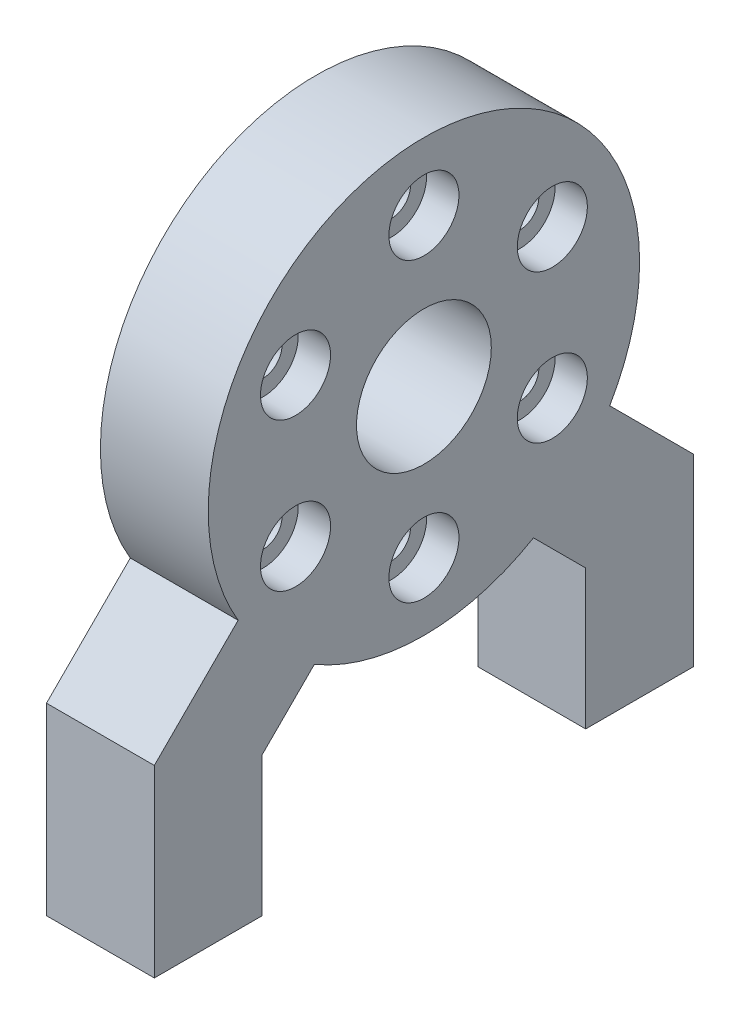
ISO-10303-21;
HEADER;
FILE_DESCRIPTION(('STEP AP214'),'2;1');
FILE_NAME('part.step','',(''),(''),'','','');
FILE_SCHEMA(('AUTOMOTIVE_DESIGN { 1 0 10303 214 1 1 1 1 }'));
ENDSEC;
DATA;
#1=APPLICATION_CONTEXT('core data for automotive mechanical design processes');
#2=APPLICATION_PROTOCOL_DEFINITION('international standard','automotive_design',2000,#1);
#3=PRODUCT_CONTEXT('',#1,'mechanical');
#4=PRODUCT('Part','Part','',(#3));
#5=PRODUCT_RELATED_PRODUCT_CATEGORY('part','',(#4));
#6=PRODUCT_DEFINITION_FORMATION('','',#4);
#7=PRODUCT_DEFINITION_CONTEXT('part definition',#1,'design');
#8=PRODUCT_DEFINITION('design','',#6,#7);
#9=PRODUCT_DEFINITION_SHAPE('','',#8);
#10=(LENGTH_UNIT() NAMED_UNIT(*) SI_UNIT(.MILLI.,.METRE.));
#11=(NAMED_UNIT(*) PLANE_ANGLE_UNIT() SI_UNIT($,.RADIAN.));
#12=(NAMED_UNIT(*) SI_UNIT($,.STERADIAN.) SOLID_ANGLE_UNIT());
#13=UNCERTAINTY_MEASURE_WITH_UNIT(LENGTH_MEASURE(1.E-05),#10,'distance_accuracy_value','');
#14=(GEOMETRIC_REPRESENTATION_CONTEXT(3) GLOBAL_UNCERTAINTY_ASSIGNED_CONTEXT((#13)) GLOBAL_UNIT_ASSIGNED_CONTEXT((#10,
#11,#12)) REPRESENTATION_CONTEXT('',''));
#15=CARTESIAN_POINT('',(0.,0.,0.));
#16=DIRECTION('',(0.,0.,1.));
#17=DIRECTION('',(1.,0.,0.));
#18=AXIS2_PLACEMENT_3D('',#15,#16,#17);
#19=CARTESIAN_POINT('',(5.,13.75,0.));
#20=DIRECTION('',(-1.,0.,0.));
#21=DIRECTION('',(0.,0.,1.));
#22=AXIS2_PLACEMENT_3D('',#19,#20,#21);
#23=CYLINDRICAL_SURFACE('',#22,1.75);
#24=CARTESIAN_POINT('',(-5.,13.75,0.));
#25=DIRECTION('',(1.,0.,0.));
#26=DIRECTION('',(0.,0.,-1.));
#27=AXIS2_PLACEMENT_3D('',#24,#25,#26);
#28=CIRCLE('',#27,1.75);
#29=CARTESIAN_POINT('',(-5.,13.75,-1.75));
#30=VERTEX_POINT('',#29);
#31=EDGE_CURVE('E239',#30,#30,#28,.T.);
#32=ORIENTED_EDGE('',*,*,#31,.F.);
#33=EDGE_LOOP('',(#32));
#34=FACE_BOUND('',#33,.T.);
#35=CARTESIAN_POINT('',(2.,13.75,0.));
#36=DIRECTION('',(1.,0.,0.));
#37=DIRECTION('',(0.,0.,-1.));
#38=AXIS2_PLACEMENT_3D('',#35,#36,#37);
#39=CIRCLE('',#38,1.75);
#40=CARTESIAN_POINT('',(2.,13.75,-1.75));
#41=VERTEX_POINT('',#40);
#42=EDGE_CURVE('E45',#41,#41,#39,.T.);
#43=ORIENTED_EDGE('',*,*,#42,.T.);
#44=EDGE_LOOP('',(#43));
#45=FACE_BOUND('',#44,.T.);
#46=ADVANCED_FACE('F41',(#34,#45),#23,.F.);
#47=CARTESIAN_POINT('',(5.,6.875,-11.907849302036));
#48=DIRECTION('',(-1.,0.,0.));
#49=DIRECTION('',(0.,0.,1.));
#50=AXIS2_PLACEMENT_3D('',#47,#48,#49);
#51=CYLINDRICAL_SURFACE('',#50,1.75);
#52=CARTESIAN_POINT('',(-5.,6.875,-11.907849302036));
#53=DIRECTION('',(1.,0.,0.));
#54=DIRECTION('',(0.,0.,-1.));
#55=AXIS2_PLACEMENT_3D('',#52,#53,#54);
#56=CIRCLE('',#55,1.75);
#57=CARTESIAN_POINT('',(-5.,6.875,-13.657849302036));
#58=VERTEX_POINT('',#57);
#59=EDGE_CURVE('E236',#58,#58,#56,.T.);
#60=ORIENTED_EDGE('',*,*,#59,.F.);
#61=EDGE_LOOP('',(#60));
#62=FACE_BOUND('',#61,.T.);
#63=CARTESIAN_POINT('',(2.,6.875,-11.907849302036));
#64=DIRECTION('',(1.,0.,0.));
#65=DIRECTION('',(0.,0.,-1.));
#66=AXIS2_PLACEMENT_3D('',#63,#64,#65);
#67=CIRCLE('',#66,1.75);
#68=CARTESIAN_POINT('',(2.,6.875,-13.657849302036));
#69=VERTEX_POINT('',#68);
#70=EDGE_CURVE('E261',#69,#69,#67,.T.);
#71=ORIENTED_EDGE('',*,*,#70,.T.);
#72=EDGE_LOOP('',(#71));
#73=FACE_BOUND('',#72,.T.);
#74=ADVANCED_FACE('F356',(#62,#73),#51,.F.);
#75=CARTESIAN_POINT('',(5.,-6.875,-11.907849302036));
#76=DIRECTION('',(-1.,0.,0.));
#77=DIRECTION('',(0.,0.,1.));
#78=AXIS2_PLACEMENT_3D('',#75,#76,#77);
#79=CYLINDRICAL_SURFACE('',#78,1.75);
#80=CARTESIAN_POINT('',(-5.,-6.875,-11.907849302036));
#81=DIRECTION('',(1.,0.,0.));
#82=DIRECTION('',(0.,0.,-1.));
#83=AXIS2_PLACEMENT_3D('',#80,#81,#82);
#84=CIRCLE('',#83,1.75);
#85=CARTESIAN_POINT('',(-5.,-6.875,-13.657849302036));
#86=VERTEX_POINT('',#85);
#87=EDGE_CURVE('E233',#86,#86,#84,.T.);
#88=ORIENTED_EDGE('',*,*,#87,.F.);
#89=EDGE_LOOP('',(#88));
#90=FACE_BOUND('',#89,.T.);
#91=CARTESIAN_POINT('',(2.,-6.875,-11.907849302036));
#92=DIRECTION('',(1.,0.,0.));
#93=DIRECTION('',(0.,0.,-1.));
#94=AXIS2_PLACEMENT_3D('',#91,#92,#93);
#95=CIRCLE('',#94,1.75);
#96=CARTESIAN_POINT('',(2.,-6.875,-13.657849302036));
#97=VERTEX_POINT('',#96);
#98=EDGE_CURVE('E259',#97,#97,#95,.T.);
#99=ORIENTED_EDGE('',*,*,#98,.T.);
#100=EDGE_LOOP('',(#99));
#101=FACE_BOUND('',#100,.T.);
#102=ADVANCED_FACE('F363',(#90,#101),#79,.F.);
#103=CARTESIAN_POINT('',(5.,-13.75,0.));
#104=DIRECTION('',(-1.,0.,0.));
#105=DIRECTION('',(0.,0.,1.));
#106=AXIS2_PLACEMENT_3D('',#103,#104,#105);
#107=CYLINDRICAL_SURFACE('',#106,1.75);
#108=CARTESIAN_POINT('',(-5.,-13.75,0.));
#109=DIRECTION('',(1.,0.,0.));
#110=DIRECTION('',(0.,0.,-1.));
#111=AXIS2_PLACEMENT_3D('',#108,#109,#110);
#112=CIRCLE('',#111,1.75);
#113=CARTESIAN_POINT('',(-5.,-13.75,-1.75));
#114=VERTEX_POINT('',#113);
#115=EDGE_CURVE('E230',#114,#114,#112,.T.);
#116=ORIENTED_EDGE('',*,*,#115,.F.);
#117=EDGE_LOOP('',(#116));
#118=FACE_BOUND('',#117,.T.);
#119=CARTESIAN_POINT('',(2.,-13.75,0.));
#120=DIRECTION('',(1.,0.,0.));
#121=DIRECTION('',(0.,0.,-1.));
#122=AXIS2_PLACEMENT_3D('',#119,#120,#121);
#123=CIRCLE('',#122,1.75);
#124=CARTESIAN_POINT('',(2.,-13.75,-1.75));
#125=VERTEX_POINT('',#124);
#126=EDGE_CURVE('E256',#125,#125,#123,.T.);
#127=ORIENTED_EDGE('',*,*,#126,.T.);
#128=EDGE_LOOP('',(#127));
#129=FACE_BOUND('',#128,.T.);
#130=ADVANCED_FACE('F504',(#118,#129),#107,.F.);
#131=CARTESIAN_POINT('',(5.,-6.87500000000001,11.907849302036));
#132=DIRECTION('',(-1.,0.,0.));
#133=DIRECTION('',(0.,0.,1.));
#134=AXIS2_PLACEMENT_3D('',#131,#132,#133);
#135=CYLINDRICAL_SURFACE('',#134,1.75);
#136=CARTESIAN_POINT('',(-5.,-6.87500000000001,11.907849302036));
#137=DIRECTION('',(1.,0.,0.));
#138=DIRECTION('',(0.,0.,-1.));
#139=AXIS2_PLACEMENT_3D('',#136,#137,#138);
#140=CIRCLE('',#139,1.75);
#141=CARTESIAN_POINT('',(-5.,-6.87500000000001,10.157849302036));
#142=VERTEX_POINT('',#141);
#143=EDGE_CURVE('E227',#142,#142,#140,.T.);
#144=ORIENTED_EDGE('',*,*,#143,.F.);
#145=EDGE_LOOP('',(#144));
#146=FACE_BOUND('',#145,.T.);
#147=CARTESIAN_POINT('',(2.,-6.87500000000001,11.907849302036));
#148=DIRECTION('',(1.,0.,0.));
#149=DIRECTION('',(0.,0.,-1.));
#150=AXIS2_PLACEMENT_3D('',#147,#148,#149);
#151=CIRCLE('',#150,1.75);
#152=CARTESIAN_POINT('',(2.,-6.87500000000001,10.157849302036));
#153=VERTEX_POINT('',#152);
#154=EDGE_CURVE('E252',#153,#153,#151,.T.);
#155=ORIENTED_EDGE('',*,*,#154,.T.);
#156=EDGE_LOOP('',(#155));
#157=FACE_BOUND('',#156,.T.);
#158=ADVANCED_FACE('F398',(#146,#157),#135,.F.);
#159=CARTESIAN_POINT('',(5.,6.87499999999999,11.907849302036));
#160=DIRECTION('',(-1.,0.,0.));
#161=DIRECTION('',(0.,0.,1.));
#162=AXIS2_PLACEMENT_3D('',#159,#160,#161);
#163=CYLINDRICAL_SURFACE('',#162,1.75);
#164=CARTESIAN_POINT('',(-5.,6.87499999999999,11.907849302036));
#165=DIRECTION('',(1.,0.,0.));
#166=DIRECTION('',(0.,0.,-1.));
#167=AXIS2_PLACEMENT_3D('',#164,#165,#166);
#168=CIRCLE('',#167,1.75);
#169=CARTESIAN_POINT('',(-5.,6.87499999999999,10.157849302036));
#170=VERTEX_POINT('',#169);
#171=EDGE_CURVE('E186',#170,#170,#168,.T.);
#172=ORIENTED_EDGE('',*,*,#171,.F.);
#173=EDGE_LOOP('',(#172));
#174=FACE_BOUND('',#173,.T.);
#175=CARTESIAN_POINT('',(2.,6.87499999999999,11.907849302036));
#176=DIRECTION('',(1.,0.,0.));
#177=DIRECTION('',(0.,0.,-1.));
#178=AXIS2_PLACEMENT_3D('',#175,#176,#177);
#179=CIRCLE('',#178,1.75);
#180=CARTESIAN_POINT('',(2.,6.87499999999999,10.157849302036));
#181=VERTEX_POINT('',#180);
#182=EDGE_CURVE('E249',#181,#181,#179,.T.);
#183=ORIENTED_EDGE('',*,*,#182,.T.);
#184=EDGE_LOOP('',(#183));
#185=FACE_BOUND('',#184,.T.);
#186=ADVANCED_FACE('F395',(#174,#185),#163,.F.);
#187=CARTESIAN_POINT('',(5.,0.,0.));
#188=DIRECTION('',(-1.,0.,0.));
#189=DIRECTION('',(0.,0.,1.));
#190=AXIS2_PLACEMENT_3D('',#187,#188,#189);
#191=CYLINDRICAL_SURFACE('',#190,20.);
#192=DIRECTION('',(-1.,0.,0.));
#193=VECTOR('',#192,1.);
#194=CARTESIAN_POINT('',(5.,-10.1575300316964,17.2285978435619));
#195=LINE('',#194,#193);
#196=CARTESIAN_POINT('',(5.,-10.1575300316964,17.2285978435619));
#197=VERTEX_POINT('',#196);
#198=CARTESIAN_POINT('',(-5.,-10.1575300316964,17.2285978435619));
#199=VERTEX_POINT('',#198);
#200=EDGE_CURVE('E150',#197,#199,#195,.T.);
#201=ORIENTED_EDGE('',*,*,#200,.F.);
#202=CARTESIAN_POINT('',(5.,0.,0.));
#203=DIRECTION('',(1.,0.,0.));
#204=DIRECTION('',(0.,0.,-1.));
#205=AXIS2_PLACEMENT_3D('',#202,#203,#204);
#206=CIRCLE('',#205,20.);
#207=CARTESIAN_POINT('',(5.,-10.1575300316964,-17.2285978435619));
#208=VERTEX_POINT('',#207);
#209=EDGE_CURVE('E50',#208,#197,#206,.T.);
#210=ORIENTED_EDGE('',*,*,#209,.F.);
#211=DIRECTION('',(-1.,0.,0.));
#212=VECTOR('',#211,1.);
#213=CARTESIAN_POINT('',(5.,-10.1575300316964,-17.2285978435619));
#214=LINE('',#213,#212);
#215=CARTESIAN_POINT('',(-5.,-10.1575300316964,-17.2285978435619));
#216=VERTEX_POINT('',#215);
#217=EDGE_CURVE('E193',#208,#216,#214,.T.);
#218=ORIENTED_EDGE('',*,*,#217,.T.);
#219=CARTESIAN_POINT('',(-5.,0.,0.));
#220=DIRECTION('',(1.,0.,0.));
#221=DIRECTION('',(0.,0.,-1.));
#222=AXIS2_PLACEMENT_3D('',#219,#220,#221);
#223=CIRCLE('',#222,20.);
#224=EDGE_CURVE('E66',#216,#199,#223,.T.);
#225=ORIENTED_EDGE('',*,*,#224,.T.);
#226=EDGE_LOOP('',(#201,#210,#218,#225));
#227=FACE_BOUND('',#226,.T.);
#228=ADVANCED_FACE('F43',(#227),#191,.T.);
#229=DIRECTION('',(-1.,0.,0.));
#230=VECTOR('',#229,1.);
#231=CARTESIAN_POINT('',(5.,-17.2285978435619,10.1575300316964));
#232=LINE('',#231,#230);
#233=CARTESIAN_POINT('',(5.,-17.2285978435619,10.1575300316964));
#234=VERTEX_POINT('',#233);
#235=CARTESIAN_POINT('',(-5.,-17.2285978435619,10.1575300316964));
#236=VERTEX_POINT('',#235);
#237=EDGE_CURVE('E166',#234,#236,#232,.T.);
#238=ORIENTED_EDGE('',*,*,#237,.T.);
#239=CARTESIAN_POINT('',(-5.,-17.2285978435619,-10.1575300316964));
#240=VERTEX_POINT('',#239);
#241=EDGE_CURVE('E58',#236,#240,#223,.T.);
#242=ORIENTED_EDGE('',*,*,#241,.T.);
#243=DIRECTION('',(-1.,0.,0.));
#244=VECTOR('',#243,1.);
#245=CARTESIAN_POINT('',(5.,-17.2285978435619,-10.1575300316964));
#246=LINE('',#245,#244);
#247=CARTESIAN_POINT('',(5.,-17.2285978435619,-10.1575300316964));
#248=VERTEX_POINT('',#247);
#249=EDGE_CURVE('E195',#248,#240,#246,.T.);
#250=ORIENTED_EDGE('',*,*,#249,.F.);
#251=EDGE_CURVE('E11',#234,#248,#206,.T.);
#252=ORIENTED_EDGE('',*,*,#251,.F.);
#253=EDGE_LOOP('',(#238,#242,#250,#252));
#254=FACE_BOUND('',#253,.T.);
#255=ADVANCED_FACE('F329',(#254),#191,.T.);
#256=CARTESIAN_POINT('',(5.,0.,0.));
#257=DIRECTION('',(1.,0.,0.));
#258=DIRECTION('',(0.,0.,-1.));
#259=AXIS2_PLACEMENT_3D('',#256,#257,#258);
#260=PLANE('',#259);
#261=CARTESIAN_POINT('',(5.,13.75,0.));
#262=DIRECTION('',(1.,0.,0.));
#263=DIRECTION('',(0.,0.,-1.));
#264=AXIS2_PLACEMENT_3D('',#261,#262,#263);
#265=CIRCLE('',#264,3.25);
#266=CARTESIAN_POINT('',(5.,13.75,-3.25));
#267=VERTEX_POINT('',#266);
#268=EDGE_CURVE('E278',#267,#267,#265,.T.);
#269=ORIENTED_EDGE('',*,*,#268,.F.);
#270=EDGE_LOOP('',(#269));
#271=FACE_BOUND('',#270,.T.);
#272=CARTESIAN_POINT('',(5.,6.87499999999999,11.907849302036));
#273=DIRECTION('',(1.,0.,0.));
#274=DIRECTION('',(0.,0.,-1.));
#275=AXIS2_PLACEMENT_3D('',#272,#273,#274);
#276=CIRCLE('',#275,3.25);
#277=CARTESIAN_POINT('',(5.,6.87499999999999,8.65784930203604));
#278=VERTEX_POINT('',#277);
#279=EDGE_CURVE('E287',#278,#278,#276,.T.);
#280=ORIENTED_EDGE('',*,*,#279,.F.);
#281=EDGE_LOOP('',(#280));
#282=FACE_BOUND('',#281,.T.);
#283=CARTESIAN_POINT('',(5.,-6.87500000000001,11.907849302036));
#284=DIRECTION('',(1.,0.,0.));
#285=DIRECTION('',(0.,0.,-1.));
#286=AXIS2_PLACEMENT_3D('',#283,#284,#285);
#287=CIRCLE('',#286,3.25);
#288=CARTESIAN_POINT('',(5.,-6.87500000000001,8.65784930203603));
#289=VERTEX_POINT('',#288);
#290=EDGE_CURVE('E312',#289,#289,#287,.T.);
#291=ORIENTED_EDGE('',*,*,#290,.F.);
#292=EDGE_LOOP('',(#291));
#293=FACE_BOUND('',#292,.T.);
#294=CARTESIAN_POINT('',(5.,-13.75,0.));
#295=DIRECTION('',(1.,0.,0.));
#296=DIRECTION('',(0.,0.,-1.));
#297=AXIS2_PLACEMENT_3D('',#294,#295,#296);
#298=CIRCLE('',#297,3.25);
#299=CARTESIAN_POINT('',(5.,-13.75,-3.25));
#300=VERTEX_POINT('',#299);
#301=EDGE_CURVE('E306',#300,#300,#298,.T.);
#302=ORIENTED_EDGE('',*,*,#301,.F.);
#303=EDGE_LOOP('',(#302));
#304=FACE_BOUND('',#303,.T.);
#305=CARTESIAN_POINT('',(5.,-6.875,-11.907849302036));
#306=DIRECTION('',(1.,0.,0.));
#307=DIRECTION('',(0.,0.,-1.));
#308=AXIS2_PLACEMENT_3D('',#305,#306,#307);
#309=CIRCLE('',#308,3.25);
#310=CARTESIAN_POINT('',(5.,-6.875,-15.157849302036));
#311=VERTEX_POINT('',#310);
#312=EDGE_CURVE('E300',#311,#311,#309,.T.);
#313=ORIENTED_EDGE('',*,*,#312,.F.);
#314=EDGE_LOOP('',(#313));
#315=FACE_BOUND('',#314,.T.);
#316=CARTESIAN_POINT('',(5.,6.875,-11.907849302036));
#317=DIRECTION('',(1.,0.,0.));
#318=DIRECTION('',(0.,0.,-1.));
#319=AXIS2_PLACEMENT_3D('',#316,#317,#318);
#320=CIRCLE('',#319,3.25);
#321=CARTESIAN_POINT('',(5.,6.875,-15.157849302036));
#322=VERTEX_POINT('',#321);
#323=EDGE_CURVE('E281',#322,#322,#320,.T.);
#324=ORIENTED_EDGE('',*,*,#323,.F.);
#325=EDGE_LOOP('',(#324));
#326=FACE_BOUND('',#325,.T.);
#327=ORIENTED_EDGE('',*,*,#209,.T.);
#328=DIRECTION('',(0.,-0.707106781186546,0.707106781186549));
#329=VECTOR('',#328,1.);
#330=CARTESIAN_POINT('',(5.,-17.9289321881345,25.));
#331=LINE('',#330,#329);
#332=CARTESIAN_POINT('',(5.,-17.9289321881345,25.));
#333=VERTEX_POINT('',#332);
#334=EDGE_CURVE('E132',#197,#333,#331,.T.);
#335=ORIENTED_EDGE('',*,*,#334,.T.);
#336=DIRECTION('',(0.,-1.,0.));
#337=VECTOR('',#336,1.);
#338=CARTESIAN_POINT('',(5.,-35.,25.));
#339=LINE('',#338,#337);
#340=CARTESIAN_POINT('',(5.,-35.,25.));
#341=VERTEX_POINT('',#340);
#342=EDGE_CURVE('E137',#333,#341,#339,.T.);
#343=ORIENTED_EDGE('',*,*,#342,.T.);
#344=DIRECTION('',(0.,0.,-1.));
#345=VECTOR('',#344,1.);
#346=CARTESIAN_POINT('',(5.,-35.,15.));
#347=LINE('',#346,#345);
#348=CARTESIAN_POINT('',(5.,-35.,15.));
#349=VERTEX_POINT('',#348);
#350=EDGE_CURVE('E156',#341,#349,#347,.T.);
#351=ORIENTED_EDGE('',*,*,#350,.T.);
#352=DIRECTION('',(0.,1.,0.));
#353=VECTOR('',#352,1.);
#354=CARTESIAN_POINT('',(5.,-35.,15.));
#355=LINE('',#354,#353);
#356=CARTESIAN_POINT('',(5.,-22.0710678118654,15.));
#357=VERTEX_POINT('',#356);
#358=EDGE_CURVE('E158',#349,#357,#355,.T.);
#359=ORIENTED_EDGE('',*,*,#358,.T.);
#360=DIRECTION('',(0.,0.707106781186547,-0.707106781186548));
#361=VECTOR('',#360,1.);
#362=CARTESIAN_POINT('',(5.,-22.0710678118654,15.));
#363=LINE('',#362,#361);
#364=EDGE_CURVE('E163',#357,#234,#363,.T.);
#365=ORIENTED_EDGE('',*,*,#364,.T.);
#366=ORIENTED_EDGE('',*,*,#251,.T.);
#367=DIRECTION('',(0.,-0.707106781186547,-0.707106781186548));
#368=VECTOR('',#367,1.);
#369=CARTESIAN_POINT('',(5.,-22.0710678118654,-15.));
#370=LINE('',#369,#368);
#371=CARTESIAN_POINT('',(5.,-22.0710678118654,-15.));
#372=VERTEX_POINT('',#371);
#373=EDGE_CURVE('E217',#248,#372,#370,.T.);
#374=ORIENTED_EDGE('',*,*,#373,.T.);
#375=DIRECTION('',(0.,-1.,0.));
#376=VECTOR('',#375,1.);
#377=CARTESIAN_POINT('',(5.,-35.,-15.));
#378=LINE('',#377,#376);
#379=CARTESIAN_POINT('',(5.,-35.,-15.));
#380=VERTEX_POINT('',#379);
#381=EDGE_CURVE('E203',#372,#380,#378,.T.);
#382=ORIENTED_EDGE('',*,*,#381,.T.);
#383=DIRECTION('',(0.,0.,-1.));
#384=VECTOR('',#383,1.);
#385=CARTESIAN_POINT('',(5.,-35.,-15.));
#386=LINE('',#385,#384);
#387=CARTESIAN_POINT('',(5.,-35.,-25.));
#388=VERTEX_POINT('',#387);
#389=EDGE_CURVE('E207',#380,#388,#386,.T.);
#390=ORIENTED_EDGE('',*,*,#389,.T.);
#391=DIRECTION('',(0.,1.,0.));
#392=VECTOR('',#391,1.);
#393=CARTESIAN_POINT('',(5.,-35.,-25.));
#394=LINE('',#393,#392);
#395=CARTESIAN_POINT('',(5.,-17.9289321881345,-25.));
#396=VERTEX_POINT('',#395);
#397=EDGE_CURVE('E221',#388,#396,#394,.T.);
#398=ORIENTED_EDGE('',*,*,#397,.T.);
#399=DIRECTION('',(0.,0.707106781186546,0.707106781186549));
#400=VECTOR('',#399,1.);
#401=CARTESIAN_POINT('',(5.,-17.9289321881345,-25.));
#402=LINE('',#401,#400);
#403=EDGE_CURVE('E219',#396,#208,#402,.T.);
#404=ORIENTED_EDGE('',*,*,#403,.T.);
#405=EDGE_LOOP('',(#327,#335,#343,#351,#359,#365,#366,#374,#382,#390,#398,#404));
#406=FACE_BOUND('',#405,.T.);
#407=CARTESIAN_POINT('',(5.,0.,0.));
#408=DIRECTION('',(1.,0.,0.));
#409=DIRECTION('',(0.,0.,-1.));
#410=AXIS2_PLACEMENT_3D('',#407,#408,#409);
#411=CIRCLE('',#410,6.25);
#412=CARTESIAN_POINT('',(5.,0.,-6.25));
#413=VERTEX_POINT('',#412);
#414=EDGE_CURVE('E243',#413,#413,#411,.T.);
#415=ORIENTED_EDGE('',*,*,#414,.F.);
#416=EDGE_LOOP('',(#415));
#417=FACE_BOUND('',#416,.T.);
#418=ADVANCED_FACE('F134',(#271,#282,#293,#304,#315,#326,#406,#417),#260,.T.);
#419=CARTESIAN_POINT('',(-5.,0.,0.));
#420=DIRECTION('',(1.,0.,0.));
#421=DIRECTION('',(0.,0.,-1.));
#422=AXIS2_PLACEMENT_3D('',#419,#420,#421);
#423=PLANE('',#422);
#424=ORIENTED_EDGE('',*,*,#241,.F.);
#425=DIRECTION('',(0.,0.707106781186547,-0.707106781186548));
#426=VECTOR('',#425,1.);
#427=CARTESIAN_POINT('',(-5.,-22.0710678118654,15.));
#428=LINE('',#427,#426);
#429=CARTESIAN_POINT('',(-5.,-22.0710678118654,15.));
#430=VERTEX_POINT('',#429);
#431=EDGE_CURVE('E142',#430,#236,#428,.T.);
#432=ORIENTED_EDGE('',*,*,#431,.F.);
#433=DIRECTION('',(0.,1.,0.));
#434=VECTOR('',#433,1.);
#435=CARTESIAN_POINT('',(-5.,-35.,15.));
#436=LINE('',#435,#434);
#437=CARTESIAN_POINT('',(-5.,-35.,15.));
#438=VERTEX_POINT('',#437);
#439=EDGE_CURVE('E173',#438,#430,#436,.T.);
#440=ORIENTED_EDGE('',*,*,#439,.F.);
#441=DIRECTION('',(0.,0.,-1.));
#442=VECTOR('',#441,1.);
#443=CARTESIAN_POINT('',(-5.,-35.,15.));
#444=LINE('',#443,#442);
#445=CARTESIAN_POINT('',(-5.,-35.,25.));
#446=VERTEX_POINT('',#445);
#447=EDGE_CURVE('E171',#446,#438,#444,.T.);
#448=ORIENTED_EDGE('',*,*,#447,.F.);
#449=DIRECTION('',(0.,-1.,0.));
#450=VECTOR('',#449,1.);
#451=CARTESIAN_POINT('',(-5.,-35.,25.));
#452=LINE('',#451,#450);
#453=CARTESIAN_POINT('',(-5.,-17.9289321881345,25.));
#454=VERTEX_POINT('',#453);
#455=EDGE_CURVE('E168',#454,#446,#452,.T.);
#456=ORIENTED_EDGE('',*,*,#455,.F.);
#457=DIRECTION('',(0.,-0.707106781186546,0.707106781186549));
#458=VECTOR('',#457,1.);
#459=CARTESIAN_POINT('',(-5.,-17.9289321881345,25.));
#460=LINE('',#459,#458);
#461=EDGE_CURVE('E147',#199,#454,#460,.T.);
#462=ORIENTED_EDGE('',*,*,#461,.F.);
#463=ORIENTED_EDGE('',*,*,#224,.F.);
#464=DIRECTION('',(0.,0.707106781186546,0.707106781186549));
#465=VECTOR('',#464,1.);
#466=CARTESIAN_POINT('',(-5.,-17.9289321881345,-25.));
#467=LINE('',#466,#465);
#468=CARTESIAN_POINT('',(-5.,-17.9289321881345,-25.));
#469=VERTEX_POINT('',#468);
#470=EDGE_CURVE('E209',#469,#216,#467,.T.);
#471=ORIENTED_EDGE('',*,*,#470,.F.);
#472=DIRECTION('',(0.,1.,0.));
#473=VECTOR('',#472,1.);
#474=CARTESIAN_POINT('',(-5.,-35.,-25.));
#475=LINE('',#474,#473);
#476=CARTESIAN_POINT('',(-5.,-35.,-25.));
#477=VERTEX_POINT('',#476);
#478=EDGE_CURVE('E212',#477,#469,#475,.T.);
#479=ORIENTED_EDGE('',*,*,#478,.F.);
#480=DIRECTION('',(0.,0.,-1.));
#481=VECTOR('',#480,1.);
#482=CARTESIAN_POINT('',(-5.,-35.,-15.));
#483=LINE('',#482,#481);
#484=CARTESIAN_POINT('',(-5.,-35.,-15.));
#485=VERTEX_POINT('',#484);
#486=EDGE_CURVE('E169',#485,#477,#483,.T.);
#487=ORIENTED_EDGE('',*,*,#486,.F.);
#488=DIRECTION('',(0.,-1.,0.));
#489=VECTOR('',#488,1.);
#490=CARTESIAN_POINT('',(-5.,-35.,-15.));
#491=LINE('',#490,#489);
#492=CARTESIAN_POINT('',(-5.,-22.0710678118654,-15.));
#493=VERTEX_POINT('',#492);
#494=EDGE_CURVE('E204',#493,#485,#491,.T.);
#495=ORIENTED_EDGE('',*,*,#494,.F.);
#496=DIRECTION('',(0.,-0.707106781186547,-0.707106781186548));
#497=VECTOR('',#496,1.);
#498=CARTESIAN_POINT('',(-5.,-22.0710678118654,-15.));
#499=LINE('',#498,#497);
#500=EDGE_CURVE('E206',#240,#493,#499,.T.);
#501=ORIENTED_EDGE('',*,*,#500,.F.);
#502=EDGE_LOOP('',(#424,#432,#440,#448,#456,#462,#463,#471,#479,#487,#495,#501));
#503=FACE_BOUND('',#502,.T.);
#504=CARTESIAN_POINT('',(-5.,0.,0.));
#505=DIRECTION('',(1.,0.,0.));
#506=DIRECTION('',(0.,0.,-1.));
#507=AXIS2_PLACEMENT_3D('',#504,#505,#506);
#508=CIRCLE('',#507,6.25);
#509=CARTESIAN_POINT('',(-5.,0.,-6.25));
#510=VERTEX_POINT('',#509);
#511=EDGE_CURVE('E242',#510,#510,#508,.T.);
#512=ORIENTED_EDGE('',*,*,#511,.T.);
#513=EDGE_LOOP('',(#512));
#514=FACE_BOUND('',#513,.T.);
#515=ORIENTED_EDGE('',*,*,#31,.T.);
#516=EDGE_LOOP('',(#515));
#517=FACE_BOUND('',#516,.T.);
#518=ORIENTED_EDGE('',*,*,#59,.T.);
#519=EDGE_LOOP('',(#518));
#520=FACE_BOUND('',#519,.T.);
#521=ORIENTED_EDGE('',*,*,#87,.T.);
#522=EDGE_LOOP('',(#521));
#523=FACE_BOUND('',#522,.T.);
#524=ORIENTED_EDGE('',*,*,#115,.T.);
#525=EDGE_LOOP('',(#524));
#526=FACE_BOUND('',#525,.T.);
#527=ORIENTED_EDGE('',*,*,#143,.T.);
#528=EDGE_LOOP('',(#527));
#529=FACE_BOUND('',#528,.T.);
#530=ORIENTED_EDGE('',*,*,#171,.T.);
#531=EDGE_LOOP('',(#530));
#532=FACE_BOUND('',#531,.T.);
#533=ADVANCED_FACE('F328',(#503,#514,#517,#520,#523,#526,#529,#532),#423,.F.);
#534=CARTESIAN_POINT('',(5.,0.,0.));
#535=DIRECTION('',(-1.,0.,0.));
#536=DIRECTION('',(0.,0.,1.));
#537=AXIS2_PLACEMENT_3D('',#534,#535,#536);
#538=CYLINDRICAL_SURFACE('',#537,6.25);
#539=ORIENTED_EDGE('',*,*,#414,.T.);
#540=EDGE_LOOP('',(#539));
#541=FACE_BOUND('',#540,.T.);
#542=ORIENTED_EDGE('',*,*,#511,.F.);
#543=EDGE_LOOP('',(#542));
#544=FACE_BOUND('',#543,.T.);
#545=ADVANCED_FACE('F369',(#541,#544),#538,.F.);
#546=CARTESIAN_POINT('',(5.,-35.,-15.));
#547=DIRECTION('',(0.,1.,0.));
#548=DIRECTION('',(0.,0.,1.));
#549=AXIS2_PLACEMENT_3D('',#546,#547,#548);
#550=PLANE('',#549);
#551=CARTESIAN_POINT('',(0.,-35.,-20.));
#552=DIRECTION('',(0.,-1.,0.));
#553=DIRECTION('',(0.,0.,-1.));
#554=AXIS2_PLACEMENT_3D('',#551,#552,#553);
#555=CIRCLE('',#554,2.5);
#556=CARTESIAN_POINT('',(0.,-35.,-22.5));
#557=VERTEX_POINT('',#556);
#558=EDGE_CURVE('E442',#557,#557,#555,.T.);
#559=ORIENTED_EDGE('',*,*,#558,.F.);
#560=EDGE_LOOP('',(#559));
#561=FACE_BOUND('',#560,.T.);
#562=ORIENTED_EDGE('',*,*,#486,.T.);
#563=DIRECTION('',(-1.,0.,0.));
#564=VECTOR('',#563,1.);
#565=CARTESIAN_POINT('',(5.,-35.,-25.));
#566=LINE('',#565,#564);
#567=EDGE_CURVE('E187',#388,#477,#566,.T.);
#568=ORIENTED_EDGE('',*,*,#567,.F.);
#569=ORIENTED_EDGE('',*,*,#389,.F.);
#570=DIRECTION('',(-1.,0.,0.));
#571=VECTOR('',#570,1.);
#572=CARTESIAN_POINT('',(5.,-35.,-15.));
#573=LINE('',#572,#571);
#574=EDGE_CURVE('E200',#380,#485,#573,.T.);
#575=ORIENTED_EDGE('',*,*,#574,.T.);
#576=EDGE_LOOP('',(#562,#568,#569,#575));
#577=FACE_BOUND('',#576,.T.);
#578=ADVANCED_FACE('F371',(#561,#577),#550,.F.);
#579=CARTESIAN_POINT('',(5.,-35.,-25.));
#580=DIRECTION('',(0.,0.,1.));
#581=DIRECTION('',(0.,-1.,0.));
#582=AXIS2_PLACEMENT_3D('',#579,#580,#581);
#583=PLANE('',#582);
#584=ORIENTED_EDGE('',*,*,#478,.T.);
#585=DIRECTION('',(-1.,0.,0.));
#586=VECTOR('',#585,1.);
#587=CARTESIAN_POINT('',(5.,-17.9289321881345,-25.));
#588=LINE('',#587,#586);
#589=EDGE_CURVE('E190',#396,#469,#588,.T.);
#590=ORIENTED_EDGE('',*,*,#589,.F.);
#591=ORIENTED_EDGE('',*,*,#397,.F.);
#592=ORIENTED_EDGE('',*,*,#567,.T.);
#593=EDGE_LOOP('',(#584,#590,#591,#592));
#594=FACE_BOUND('',#593,.T.);
#595=ADVANCED_FACE('F452',(#594),#583,.F.);
#596=CARTESIAN_POINT('',(5.,-17.9289321881345,-25.));
#597=DIRECTION('',(0.,-0.707106781186549,0.707106781186546));
#598=DIRECTION('',(0.,-0.707106781186546,-0.707106781186549));
#599=AXIS2_PLACEMENT_3D('',#596,#597,#598);
#600=PLANE('',#599);
#601=ORIENTED_EDGE('',*,*,#470,.T.);
#602=ORIENTED_EDGE('',*,*,#217,.F.);
#603=ORIENTED_EDGE('',*,*,#403,.F.);
#604=ORIENTED_EDGE('',*,*,#589,.T.);
#605=EDGE_LOOP('',(#601,#602,#603,#604));
#606=FACE_BOUND('',#605,.T.);
#607=ADVANCED_FACE('F494',(#606),#600,.F.);
#608=CARTESIAN_POINT('',(5.,-22.0710678118654,-15.));
#609=DIRECTION('',(0.,0.707106781186548,-0.707106781186547));
#610=DIRECTION('',(0.,0.707106781186547,0.707106781186548));
#611=AXIS2_PLACEMENT_3D('',#608,#609,#610);
#612=PLANE('',#611);
#613=ORIENTED_EDGE('',*,*,#500,.T.);
#614=DIRECTION('',(-1.,0.,0.));
#615=VECTOR('',#614,1.);
#616=CARTESIAN_POINT('',(5.,-22.0710678118654,-15.));
#617=LINE('',#616,#615);
#618=EDGE_CURVE('E197',#372,#493,#617,.T.);
#619=ORIENTED_EDGE('',*,*,#618,.F.);
#620=ORIENTED_EDGE('',*,*,#373,.F.);
#621=ORIENTED_EDGE('',*,*,#249,.T.);
#622=EDGE_LOOP('',(#613,#619,#620,#621));
#623=FACE_BOUND('',#622,.T.);
#624=ADVANCED_FACE('F469',(#623),#612,.F.);
#625=CARTESIAN_POINT('',(5.,-35.,-15.));
#626=DIRECTION('',(0.,0.,-1.));
#627=DIRECTION('',(0.,1.,0.));
#628=AXIS2_PLACEMENT_3D('',#625,#626,#627);
#629=PLANE('',#628);
#630=ORIENTED_EDGE('',*,*,#494,.T.);
#631=ORIENTED_EDGE('',*,*,#574,.F.);
#632=ORIENTED_EDGE('',*,*,#381,.F.);
#633=ORIENTED_EDGE('',*,*,#618,.T.);
#634=EDGE_LOOP('',(#630,#631,#632,#633));
#635=FACE_BOUND('',#634,.T.);
#636=ADVANCED_FACE('F467',(#635),#629,.F.);
#637=CARTESIAN_POINT('',(5.,-17.9289321881345,25.));
#638=DIRECTION('',(0.,-0.707106781186549,-0.707106781186546));
#639=DIRECTION('',(0.,0.707106781186546,-0.707106781186549));
#640=AXIS2_PLACEMENT_3D('',#637,#638,#639);
#641=PLANE('',#640);
#642=ORIENTED_EDGE('',*,*,#461,.T.);
#643=DIRECTION('',(-1.,0.,0.));
#644=VECTOR('',#643,1.);
#645=CARTESIAN_POINT('',(5.,-17.9289321881345,25.));
#646=LINE('',#645,#644);
#647=EDGE_CURVE('E145',#333,#454,#646,.T.);
#648=ORIENTED_EDGE('',*,*,#647,.F.);
#649=ORIENTED_EDGE('',*,*,#334,.F.);
#650=ORIENTED_EDGE('',*,*,#200,.T.);
#651=EDGE_LOOP('',(#642,#648,#649,#650));
#652=FACE_BOUND('',#651,.T.);
#653=ADVANCED_FACE('F146',(#652),#641,.F.);
#654=CARTESIAN_POINT('',(5.,-35.,25.));
#655=DIRECTION('',(0.,0.,-1.));
#656=DIRECTION('',(0.,1.,0.));
#657=AXIS2_PLACEMENT_3D('',#654,#655,#656);
#658=PLANE('',#657);
#659=ORIENTED_EDGE('',*,*,#455,.T.);
#660=DIRECTION('',(-1.,0.,0.));
#661=VECTOR('',#660,1.);
#662=CARTESIAN_POINT('',(5.,-35.,25.));
#663=LINE('',#662,#661);
#664=EDGE_CURVE('E151',#341,#446,#663,.T.);
#665=ORIENTED_EDGE('',*,*,#664,.F.);
#666=ORIENTED_EDGE('',*,*,#342,.F.);
#667=ORIENTED_EDGE('',*,*,#647,.T.);
#668=EDGE_LOOP('',(#659,#665,#666,#667));
#669=FACE_BOUND('',#668,.T.);
#670=ADVANCED_FACE('F153',(#669),#658,.F.);
#671=CARTESIAN_POINT('',(5.,-35.,15.));
#672=DIRECTION('',(0.,1.,0.));
#673=DIRECTION('',(0.,0.,1.));
#674=AXIS2_PLACEMENT_3D('',#671,#672,#673);
#675=PLANE('',#674);
#676=CARTESIAN_POINT('',(0.,-35.,20.));
#677=DIRECTION('',(0.,-1.,0.));
#678=DIRECTION('',(0.,0.,-1.));
#679=AXIS2_PLACEMENT_3D('',#676,#677,#678);
#680=CIRCLE('',#679,2.5);
#681=CARTESIAN_POINT('',(0.,-35.,17.5));
#682=VERTEX_POINT('',#681);
#683=EDGE_CURVE('E439',#682,#682,#680,.T.);
#684=ORIENTED_EDGE('',*,*,#683,.F.);
#685=EDGE_LOOP('',(#684));
#686=FACE_BOUND('',#685,.T.);
#687=ORIENTED_EDGE('',*,*,#447,.T.);
#688=DIRECTION('',(-1.,0.,0.));
#689=VECTOR('',#688,1.);
#690=CARTESIAN_POINT('',(5.,-35.,15.));
#691=LINE('',#690,#689);
#692=EDGE_CURVE('E181',#349,#438,#691,.T.);
#693=ORIENTED_EDGE('',*,*,#692,.F.);
#694=ORIENTED_EDGE('',*,*,#350,.F.);
#695=ORIENTED_EDGE('',*,*,#664,.T.);
#696=EDGE_LOOP('',(#687,#693,#694,#695));
#697=FACE_BOUND('',#696,.T.);
#698=ADVANCED_FACE('F479',(#686,#697),#675,.F.);
#699=CARTESIAN_POINT('',(5.,-35.,15.));
#700=DIRECTION('',(0.,0.,1.));
#701=DIRECTION('',(0.,-1.,0.));
#702=AXIS2_PLACEMENT_3D('',#699,#700,#701);
#703=PLANE('',#702);
#704=ORIENTED_EDGE('',*,*,#439,.T.);
#705=DIRECTION('',(-1.,0.,0.));
#706=VECTOR('',#705,1.);
#707=CARTESIAN_POINT('',(5.,-22.0710678118654,15.));
#708=LINE('',#707,#706);
#709=EDGE_CURVE('E178',#357,#430,#708,.T.);
#710=ORIENTED_EDGE('',*,*,#709,.F.);
#711=ORIENTED_EDGE('',*,*,#358,.F.);
#712=ORIENTED_EDGE('',*,*,#692,.T.);
#713=EDGE_LOOP('',(#704,#710,#711,#712));
#714=FACE_BOUND('',#713,.T.);
#715=ADVANCED_FACE('F415',(#714),#703,.F.);
#716=CARTESIAN_POINT('',(5.,-22.0710678118654,15.));
#717=DIRECTION('',(0.,0.707106781186548,0.707106781186547));
#718=DIRECTION('',(0.,-0.707106781186547,0.707106781186548));
#719=AXIS2_PLACEMENT_3D('',#716,#717,#718);
#720=PLANE('',#719);
#721=ORIENTED_EDGE('',*,*,#431,.T.);
#722=ORIENTED_EDGE('',*,*,#237,.F.);
#723=ORIENTED_EDGE('',*,*,#364,.F.);
#724=ORIENTED_EDGE('',*,*,#709,.T.);
#725=EDGE_LOOP('',(#721,#722,#723,#724));
#726=FACE_BOUND('',#725,.T.);
#727=ADVANCED_FACE('F409',(#726),#720,.F.);
#728=CARTESIAN_POINT('',(2.,6.87499999999999,11.907849302036));
#729=DIRECTION('',(1.,0.,0.));
#730=DIRECTION('',(0.,0.,-1.));
#731=AXIS2_PLACEMENT_3D('',#728,#729,#730);
#732=CYLINDRICAL_SURFACE('',#731,3.25);
#733=CARTESIAN_POINT('',(2.,6.87499999999999,11.907849302036));
#734=DIRECTION('',(1.,0.,0.));
#735=DIRECTION('',(0.,0.,-1.));
#736=AXIS2_PLACEMENT_3D('',#733,#734,#735);
#737=CIRCLE('',#736,3.25);
#738=CARTESIAN_POINT('',(2.,6.87499999999999,8.65784930203604));
#739=VERTEX_POINT('',#738);
#740=EDGE_CURVE('E291',#739,#739,#737,.T.);
#741=ORIENTED_EDGE('',*,*,#740,.F.);
#742=EDGE_LOOP('',(#741));
#743=FACE_BOUND('',#742,.T.);
#744=ORIENTED_EDGE('',*,*,#279,.T.);
#745=EDGE_LOOP('',(#744));
#746=FACE_BOUND('',#745,.T.);
#747=ADVANCED_FACE('F404',(#743,#746),#732,.F.);
#748=CARTESIAN_POINT('',(2.,6.87499999999999,11.907849302036));
#749=DIRECTION('',(1.,0.,0.));
#750=DIRECTION('',(0.,0.,-1.));
#751=AXIS2_PLACEMENT_3D('',#748,#749,#750);
#752=PLANE('',#751);
#753=ORIENTED_EDGE('',*,*,#182,.F.);
#754=EDGE_LOOP('',(#753));
#755=FACE_BOUND('',#754,.T.);
#756=ORIENTED_EDGE('',*,*,#740,.T.);
#757=EDGE_LOOP('',(#756));
#758=FACE_BOUND('',#757,.T.);
#759=ADVANCED_FACE('F322',(#755,#758),#752,.T.);
#760=CARTESIAN_POINT('',(2.,-6.87500000000001,11.907849302036));
#761=DIRECTION('',(1.,0.,0.));
#762=DIRECTION('',(0.,0.,-1.));
#763=AXIS2_PLACEMENT_3D('',#760,#761,#762);
#764=CYLINDRICAL_SURFACE('',#763,3.25);
#765=CARTESIAN_POINT('',(2.,-6.87500000000001,11.907849302036));
#766=DIRECTION('',(1.,0.,0.));
#767=DIRECTION('',(0.,0.,-1.));
#768=AXIS2_PLACEMENT_3D('',#765,#766,#767);
#769=CIRCLE('',#768,3.25);
#770=CARTESIAN_POINT('',(2.,-6.87500000000001,8.65784930203603));
#771=VERTEX_POINT('',#770);
#772=EDGE_CURVE('E290',#771,#771,#769,.T.);
#773=ORIENTED_EDGE('',*,*,#772,.F.);
#774=EDGE_LOOP('',(#773));
#775=FACE_BOUND('',#774,.T.);
#776=ORIENTED_EDGE('',*,*,#290,.T.);
#777=EDGE_LOOP('',(#776));
#778=FACE_BOUND('',#777,.T.);
#779=ADVANCED_FACE('F319',(#775,#778),#764,.F.);
#780=CARTESIAN_POINT('',(2.,-6.87500000000001,11.907849302036));
#781=DIRECTION('',(1.,0.,0.));
#782=DIRECTION('',(0.,0.,-1.));
#783=AXIS2_PLACEMENT_3D('',#780,#781,#782);
#784=PLANE('',#783);
#785=ORIENTED_EDGE('',*,*,#154,.F.);
#786=EDGE_LOOP('',(#785));
#787=FACE_BOUND('',#786,.T.);
#788=ORIENTED_EDGE('',*,*,#772,.T.);
#789=EDGE_LOOP('',(#788));
#790=FACE_BOUND('',#789,.T.);
#791=ADVANCED_FACE('F317',(#787,#790),#784,.T.);
#792=CARTESIAN_POINT('',(2.,-13.75,0.));
#793=DIRECTION('',(1.,0.,0.));
#794=DIRECTION('',(0.,0.,-1.));
#795=AXIS2_PLACEMENT_3D('',#792,#793,#794);
#796=CYLINDRICAL_SURFACE('',#795,3.25);
#797=CARTESIAN_POINT('',(2.,-13.75,0.));
#798=DIRECTION('',(1.,0.,0.));
#799=DIRECTION('',(0.,0.,-1.));
#800=AXIS2_PLACEMENT_3D('',#797,#798,#799);
#801=CIRCLE('',#800,3.25);
#802=CARTESIAN_POINT('',(2.,-13.75,-3.25));
#803=VERTEX_POINT('',#802);
#804=EDGE_CURVE('E309',#803,#803,#801,.T.);
#805=ORIENTED_EDGE('',*,*,#804,.F.);
#806=EDGE_LOOP('',(#805));
#807=FACE_BOUND('',#806,.T.);
#808=ORIENTED_EDGE('',*,*,#301,.T.);
#809=EDGE_LOOP('',(#808));
#810=FACE_BOUND('',#809,.T.);
#811=ADVANCED_FACE('F524',(#807,#810),#796,.F.);
#812=CARTESIAN_POINT('',(2.,-13.75,0.));
#813=DIRECTION('',(1.,0.,0.));
#814=DIRECTION('',(0.,0.,-1.));
#815=AXIS2_PLACEMENT_3D('',#812,#813,#814);
#816=PLANE('',#815);
#817=ORIENTED_EDGE('',*,*,#126,.F.);
#818=EDGE_LOOP('',(#817));
#819=FACE_BOUND('',#818,.T.);
#820=ORIENTED_EDGE('',*,*,#804,.T.);
#821=EDGE_LOOP('',(#820));
#822=FACE_BOUND('',#821,.T.);
#823=ADVANCED_FACE('F519',(#819,#822),#816,.T.);
#824=CARTESIAN_POINT('',(2.,-6.875,-11.907849302036));
#825=DIRECTION('',(1.,0.,0.));
#826=DIRECTION('',(0.,0.,-1.));
#827=AXIS2_PLACEMENT_3D('',#824,#825,#826);
#828=CYLINDRICAL_SURFACE('',#827,3.25);
#829=CARTESIAN_POINT('',(2.,-6.875,-11.907849302036));
#830=DIRECTION('',(1.,0.,0.));
#831=DIRECTION('',(0.,0.,-1.));
#832=AXIS2_PLACEMENT_3D('',#829,#830,#831);
#833=CIRCLE('',#832,3.25);
#834=CARTESIAN_POINT('',(2.,-6.875,-15.157849302036));
#835=VERTEX_POINT('',#834);
#836=EDGE_CURVE('E303',#835,#835,#833,.T.);
#837=ORIENTED_EDGE('',*,*,#836,.F.);
#838=EDGE_LOOP('',(#837));
#839=FACE_BOUND('',#838,.T.);
#840=ORIENTED_EDGE('',*,*,#312,.T.);
#841=EDGE_LOOP('',(#840));
#842=FACE_BOUND('',#841,.T.);
#843=ADVANCED_FACE('F350',(#839,#842),#828,.F.);
#844=CARTESIAN_POINT('',(2.,-6.875,-11.907849302036));
#845=DIRECTION('',(1.,0.,0.));
#846=DIRECTION('',(0.,0.,-1.));
#847=AXIS2_PLACEMENT_3D('',#844,#845,#846);
#848=PLANE('',#847);
#849=ORIENTED_EDGE('',*,*,#98,.F.);
#850=EDGE_LOOP('',(#849));
#851=FACE_BOUND('',#850,.T.);
#852=ORIENTED_EDGE('',*,*,#836,.T.);
#853=EDGE_LOOP('',(#852));
#854=FACE_BOUND('',#853,.T.);
#855=ADVANCED_FACE('F341',(#851,#854),#848,.T.);
#856=CARTESIAN_POINT('',(2.,6.875,-11.907849302036));
#857=DIRECTION('',(1.,0.,0.));
#858=DIRECTION('',(0.,0.,-1.));
#859=AXIS2_PLACEMENT_3D('',#856,#857,#858);
#860=CYLINDRICAL_SURFACE('',#859,3.25);
#861=CARTESIAN_POINT('',(2.,6.875,-11.907849302036));
#862=DIRECTION('',(1.,0.,0.));
#863=DIRECTION('',(0.,0.,-1.));
#864=AXIS2_PLACEMENT_3D('',#861,#862,#863);
#865=CIRCLE('',#864,3.25);
#866=CARTESIAN_POINT('',(2.,6.875,-15.157849302036));
#867=VERTEX_POINT('',#866);
#868=EDGE_CURVE('E297',#867,#867,#865,.T.);
#869=ORIENTED_EDGE('',*,*,#868,.F.);
#870=EDGE_LOOP('',(#869));
#871=FACE_BOUND('',#870,.T.);
#872=ORIENTED_EDGE('',*,*,#323,.T.);
#873=EDGE_LOOP('',(#872));
#874=FACE_BOUND('',#873,.T.);
#875=ADVANCED_FACE('F338',(#871,#874),#860,.F.);
#876=CARTESIAN_POINT('',(2.,6.875,-11.907849302036));
#877=DIRECTION('',(1.,0.,0.));
#878=DIRECTION('',(0.,0.,-1.));
#879=AXIS2_PLACEMENT_3D('',#876,#877,#878);
#880=PLANE('',#879);
#881=ORIENTED_EDGE('',*,*,#70,.F.);
#882=EDGE_LOOP('',(#881));
#883=FACE_BOUND('',#882,.T.);
#884=ORIENTED_EDGE('',*,*,#868,.T.);
#885=EDGE_LOOP('',(#884));
#886=FACE_BOUND('',#885,.T.);
#887=ADVANCED_FACE('F340',(#883,#886),#880,.T.);
#888=CARTESIAN_POINT('',(2.,13.75,0.));
#889=DIRECTION('',(1.,0.,0.));
#890=DIRECTION('',(0.,0.,-1.));
#891=AXIS2_PLACEMENT_3D('',#888,#889,#890);
#892=CYLINDRICAL_SURFACE('',#891,3.25);
#893=CARTESIAN_POINT('',(2.,13.75,0.));
#894=DIRECTION('',(1.,0.,0.));
#895=DIRECTION('',(0.,0.,-1.));
#896=AXIS2_PLACEMENT_3D('',#893,#894,#895);
#897=CIRCLE('',#896,3.25);
#898=CARTESIAN_POINT('',(2.,13.75,-3.25));
#899=VERTEX_POINT('',#898);
#900=EDGE_CURVE('E253',#899,#899,#897,.T.);
#901=ORIENTED_EDGE('',*,*,#900,.F.);
#902=EDGE_LOOP('',(#901));
#903=FACE_BOUND('',#902,.T.);
#904=ORIENTED_EDGE('',*,*,#268,.T.);
#905=EDGE_LOOP('',(#904));
#906=FACE_BOUND('',#905,.T.);
#907=ADVANCED_FACE('F273',(#903,#906),#892,.F.);
#908=CARTESIAN_POINT('',(2.,13.75,0.));
#909=DIRECTION('',(1.,0.,0.));
#910=DIRECTION('',(0.,0.,-1.));
#911=AXIS2_PLACEMENT_3D('',#908,#909,#910);
#912=PLANE('',#911);
#913=ORIENTED_EDGE('',*,*,#42,.F.);
#914=EDGE_LOOP('',(#913));
#915=FACE_BOUND('',#914,.T.);
#916=ORIENTED_EDGE('',*,*,#900,.T.);
#917=EDGE_LOOP('',(#916));
#918=FACE_BOUND('',#917,.T.);
#919=ADVANCED_FACE('F269',(#915,#918),#912,.T.);
#920=CARTESIAN_POINT('',(0.,-25.,20.));
#921=DIRECTION('',(0.,-1.,0.));
#922=DIRECTION('',(0.,0.,-1.));
#923=AXIS2_PLACEMENT_3D('',#920,#921,#922);
#924=CYLINDRICAL_SURFACE('',#923,2.5);
#925=CARTESIAN_POINT('',(0.,-25.,20.));
#926=DIRECTION('',(0.,-1.,0.));
#927=DIRECTION('',(0.,0.,-1.));
#928=AXIS2_PLACEMENT_3D('',#925,#926,#927);
#929=CIRCLE('',#928,2.5);
#930=CARTESIAN_POINT('',(0.,-25.,17.5));
#931=VERTEX_POINT('',#930);
#932=EDGE_CURVE('E294',#931,#931,#929,.T.);
#933=ORIENTED_EDGE('',*,*,#932,.F.);
#934=EDGE_LOOP('',(#933));
#935=FACE_BOUND('',#934,.T.);
#936=ORIENTED_EDGE('',*,*,#683,.T.);
#937=EDGE_LOOP('',(#936));
#938=FACE_BOUND('',#937,.T.);
#939=ADVANCED_FACE('F272',(#935,#938),#924,.F.);
#940=CARTESIAN_POINT('',(0.,-25.,20.));
#941=DIRECTION('',(0.,-1.,0.));
#942=DIRECTION('',(0.,0.,-1.));
#943=AXIS2_PLACEMENT_3D('',#940,#941,#942);
#944=PLANE('',#943);
#945=ORIENTED_EDGE('',*,*,#932,.T.);
#946=EDGE_LOOP('',(#945));
#947=FACE_BOUND('',#946,.T.);
#948=ADVANCED_FACE('F428',(#947),#944,.T.);
#949=CARTESIAN_POINT('',(0.,-25.,-20.));
#950=DIRECTION('',(0.,-1.,0.));
#951=DIRECTION('',(0.,0.,-1.));
#952=AXIS2_PLACEMENT_3D('',#949,#950,#951);
#953=CYLINDRICAL_SURFACE('',#952,2.5);
#954=CARTESIAN_POINT('',(0.,-25.,-20.));
#955=DIRECTION('',(0.,-1.,0.));
#956=DIRECTION('',(0.,0.,-1.));
#957=AXIS2_PLACEMENT_3D('',#954,#955,#956);
#958=CIRCLE('',#957,2.5);
#959=CARTESIAN_POINT('',(0.,-25.,-22.5));
#960=VERTEX_POINT('',#959);
#961=EDGE_CURVE('E284',#960,#960,#958,.T.);
#962=ORIENTED_EDGE('',*,*,#961,.F.);
#963=EDGE_LOOP('',(#962));
#964=FACE_BOUND('',#963,.T.);
#965=ORIENTED_EDGE('',*,*,#558,.T.);
#966=EDGE_LOOP('',(#965));
#967=FACE_BOUND('',#966,.T.);
#968=ADVANCED_FACE('F424',(#964,#967),#953,.F.);
#969=CARTESIAN_POINT('',(0.,-25.,-20.));
#970=DIRECTION('',(0.,-1.,0.));
#971=DIRECTION('',(0.,0.,-1.));
#972=AXIS2_PLACEMENT_3D('',#969,#970,#971);
#973=PLANE('',#972);
#974=ORIENTED_EDGE('',*,*,#961,.T.);
#975=EDGE_LOOP('',(#974));
#976=FACE_BOUND('',#975,.T.);
#977=ADVANCED_FACE('F421',(#976),#973,.T.);
#978=CLOSED_SHELL('',(#46,#74,#102,#130,#158,#186,#228,#255,#418,#533,#545,#578,#595,#607,#624,
#636,#653,#670,#698,#715,#727,#747,#759,#779,#791,#811,#823,#843,#855,#875,#887,#907,#919,#939,
#948,#968,#977));
#979=MANIFOLD_SOLID_BREP('B2',#978);
#980=ADVANCED_BREP_SHAPE_REPRESENTATION('',(#18,#979),#14);
#981=SHAPE_DEFINITION_REPRESENTATION(#9,#980);
ENDSEC;
END-ISO-10303-21;
